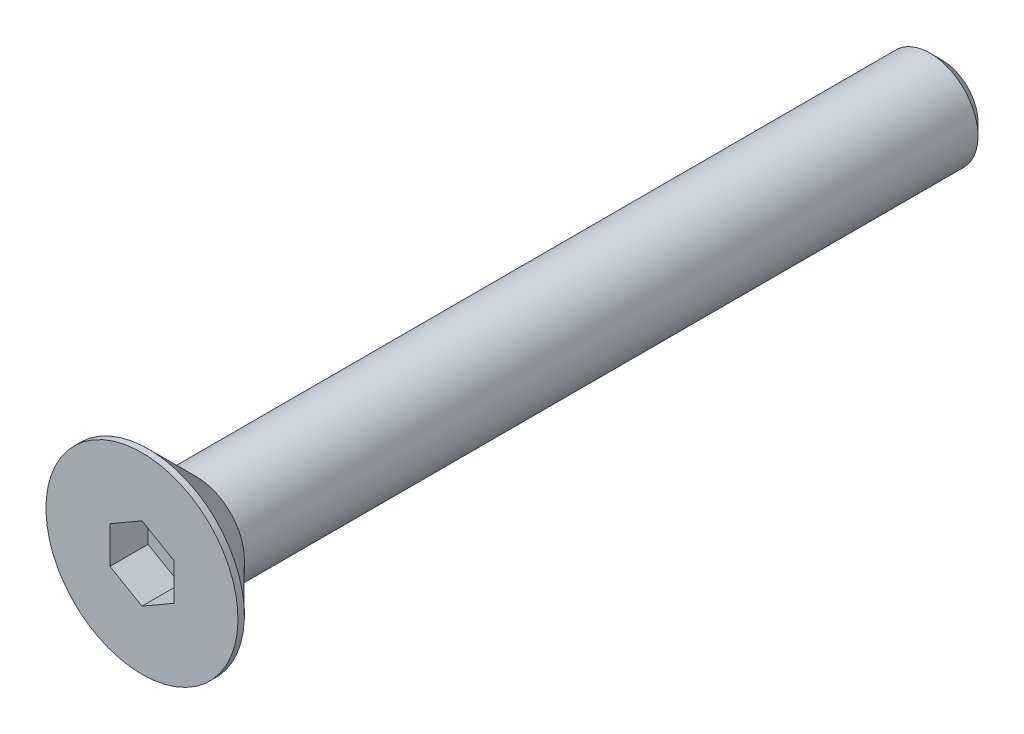
ISO-10303-21;
HEADER;
FILE_DESCRIPTION(('STEP AP214'),'2;1');
FILE_NAME('part.step','',(''),(''),'','','');
FILE_SCHEMA(('AUTOMOTIVE_DESIGN { 1 0 10303 214 1 1 1 1 }'));
ENDSEC;
DATA;
#1=APPLICATION_CONTEXT('core data for automotive mechanical design processes');
#2=APPLICATION_PROTOCOL_DEFINITION('international standard','automotive_design',2000,#1);
#3=PRODUCT_CONTEXT('',#1,'mechanical');
#4=PRODUCT('Part','Part','',(#3));
#5=PRODUCT_RELATED_PRODUCT_CATEGORY('part','',(#4));
#6=PRODUCT_DEFINITION_FORMATION('','',#4);
#7=PRODUCT_DEFINITION_CONTEXT('part definition',#1,'design');
#8=PRODUCT_DEFINITION('design','',#6,#7);
#9=PRODUCT_DEFINITION_SHAPE('','',#8);
#10=(LENGTH_UNIT() NAMED_UNIT(*) SI_UNIT(.MILLI.,.METRE.));
#11=(NAMED_UNIT(*) PLANE_ANGLE_UNIT() SI_UNIT($,.RADIAN.));
#12=(NAMED_UNIT(*) SI_UNIT($,.STERADIAN.) SOLID_ANGLE_UNIT());
#13=UNCERTAINTY_MEASURE_WITH_UNIT(LENGTH_MEASURE(1.E-05),#10,'distance_accuracy_value','');
#14=(GEOMETRIC_REPRESENTATION_CONTEXT(3) GLOBAL_UNCERTAINTY_ASSIGNED_CONTEXT((#13)) GLOBAL_UNIT_ASSIGNED_CONTEXT((#10,
#11,#12)) REPRESENTATION_CONTEXT('',''));
#15=CARTESIAN_POINT('',(0.,0.,0.));
#16=DIRECTION('',(0.,0.,1.));
#17=DIRECTION('',(1.,0.,0.));
#18=AXIS2_PLACEMENT_3D('',#15,#16,#17);
#19=CARTESIAN_POINT('',(0.,0.,-25.));
#20=DIRECTION('',(0.,0.,-1.));
#21=DIRECTION('',(0.,1.,0.));
#22=AXIS2_PLACEMENT_3D('',#19,#20,#21);
#23=CYLINDRICAL_SURFACE('',#22,1.5);
#24=CARTESIAN_POINT('',(0.,0.,-24.625));
#25=DIRECTION('',(0.,0.,-1.));
#26=DIRECTION('',(0.,1.,0.));
#27=AXIS2_PLACEMENT_3D('',#24,#25,#26);
#28=CIRCLE('',#27,1.5);
#29=CARTESIAN_POINT('',(0.,1.5,-24.625));
#30=VERTEX_POINT('',#29);
#31=EDGE_CURVE('E11',#30,#30,#28,.F.);
#32=ORIENTED_EDGE('',*,*,#31,.T.);
#33=EDGE_LOOP('',(#32));
#34=FACE_BOUND('',#33,.T.);
#35=CARTESIAN_POINT('',(0.,0.,-1.7));
#36=DIRECTION('',(0.,0.,1.));
#37=DIRECTION('',(0.,-1.,0.));
#38=AXIS2_PLACEMENT_3D('',#35,#36,#37);
#39=CIRCLE('',#38,1.50000000000001);
#40=CARTESIAN_POINT('',(0.,-1.50000000000001,-1.7));
#41=VERTEX_POINT('',#40);
#42=EDGE_CURVE('E140',#41,#41,#39,.T.);
#43=ORIENTED_EDGE('',*,*,#42,.F.);
#44=EDGE_LOOP('',(#43));
#45=FACE_BOUND('',#44,.T.);
#46=ADVANCED_FACE('F38',(#34,#45),#23,.T.);
#47=CARTESIAN_POINT('',(0.,-1.5,-25.));
#48=DIRECTION('',(0.,0.,-1.));
#49=DIRECTION('',(0.,1.,0.));
#50=AXIS2_PLACEMENT_3D('',#47,#48,#49);
#51=PLANE('',#50);
#52=CARTESIAN_POINT('',(0.,0.,-25.));
#53=DIRECTION('',(0.,0.,-1.));
#54=DIRECTION('',(0.,1.,0.));
#55=AXIS2_PLACEMENT_3D('',#52,#53,#54);
#56=CIRCLE('',#55,1.125);
#57=CARTESIAN_POINT('',(0.,1.125,-25.));
#58=VERTEX_POINT('',#57);
#59=EDGE_CURVE('E46',#58,#58,#56,.T.);
#60=ORIENTED_EDGE('',*,*,#59,.T.);
#61=EDGE_LOOP('',(#60));
#62=FACE_BOUND('',#61,.T.);
#63=ADVANCED_FACE('F156',(#62),#51,.T.);
#64=CARTESIAN_POINT('',(0.,0.,-25.));
#65=DIRECTION('',(0.,0.,1.));
#66=DIRECTION('',(0.,-1.,0.));
#67=AXIS2_PLACEMENT_3D('',#64,#65,#66);
#68=CONICAL_SURFACE('',#67,1.125,0.785398163397445);
#69=ORIENTED_EDGE('',*,*,#31,.F.);
#70=EDGE_LOOP('',(#69));
#71=FACE_BOUND('',#70,.T.);
#72=ORIENTED_EDGE('',*,*,#59,.F.);
#73=EDGE_LOOP('',(#72));
#74=FACE_BOUND('',#73,.T.);
#75=ADVANCED_FACE('F40',(#71,#74),#68,.T.);
#76=CARTESIAN_POINT('',(0.,0.,0.));
#77=DIRECTION('',(0.,0.,1.));
#78=DIRECTION('',(0.,-1.,0.));
#79=AXIS2_PLACEMENT_3D('',#76,#77,#78);
#80=CYLINDRICAL_SURFACE('',#79,3.);
#81=CARTESIAN_POINT('',(0.,0.,0.));
#82=DIRECTION('',(0.,0.,1.));
#83=DIRECTION('',(0.,-1.,0.));
#84=AXIS2_PLACEMENT_3D('',#81,#82,#83);
#85=CIRCLE('',#84,3.);
#86=CARTESIAN_POINT('',(0.,-3.,0.));
#87=VERTEX_POINT('',#86);
#88=EDGE_CURVE('E151',#87,#87,#85,.T.);
#89=ORIENTED_EDGE('',*,*,#88,.F.);
#90=EDGE_LOOP('',(#89));
#91=FACE_BOUND('',#90,.T.);
#92=CARTESIAN_POINT('',(0.,0.,-0.200000000000009));
#93=DIRECTION('',(0.,0.,1.));
#94=DIRECTION('',(0.,-1.,0.));
#95=AXIS2_PLACEMENT_3D('',#92,#93,#94);
#96=CIRCLE('',#95,3.);
#97=CARTESIAN_POINT('',(0.,-3.,-0.200000000000006));
#98=VERTEX_POINT('',#97);
#99=EDGE_CURVE('E148',#98,#98,#96,.T.);
#100=ORIENTED_EDGE('',*,*,#99,.T.);
#101=EDGE_LOOP('',(#100));
#102=FACE_BOUND('',#101,.T.);
#103=ADVANCED_FACE('F159',(#91,#102),#80,.T.);
#104=CARTESIAN_POINT('',(0.,0.,-1.7));
#105=DIRECTION('',(0.,0.,1.));
#106=DIRECTION('',(0.,-1.,0.));
#107=AXIS2_PLACEMENT_3D('',#104,#105,#106);
#108=CONICAL_SURFACE('',#107,1.50000000000001,0.785398163397449);
#109=ORIENTED_EDGE('',*,*,#99,.F.);
#110=EDGE_LOOP('',(#109));
#111=FACE_BOUND('',#110,.T.);
#112=ORIENTED_EDGE('',*,*,#42,.T.);
#113=EDGE_LOOP('',(#112));
#114=FACE_BOUND('',#113,.T.);
#115=ADVANCED_FACE('F165',(#111,#114),#108,.T.);
#116=CARTESIAN_POINT('',(0.,-1.5,0.));
#117=DIRECTION('',(0.,0.,1.));
#118=DIRECTION('',(0.,-1.,0.));
#119=AXIS2_PLACEMENT_3D('',#116,#117,#118);
#120=PLANE('',#119);
#121=DIRECTION('',(0.866025403784439,0.499999999999999,0.));
#122=VECTOR('',#121,1.);
#123=CARTESIAN_POINT('',(0.,-1.15470053837925,0.));
#124=LINE('',#123,#122);
#125=CARTESIAN_POINT('',(0.,-1.15470053837925,0.));
#126=VERTEX_POINT('',#125);
#127=CARTESIAN_POINT('',(1.,-0.577350269189626,0.));
#128=VERTEX_POINT('',#127);
#129=EDGE_CURVE('E53',#126,#128,#124,.T.);
#130=ORIENTED_EDGE('',*,*,#129,.F.);
#131=DIRECTION('',(0.866025403784439,-0.5,0.));
#132=VECTOR('',#131,1.);
#133=CARTESIAN_POINT('',(-1.,-0.577350269189626,0.));
#134=LINE('',#133,#132);
#135=CARTESIAN_POINT('',(-1.,-0.577350269189626,0.));
#136=VERTEX_POINT('',#135);
#137=EDGE_CURVE('E136',#136,#126,#134,.T.);
#138=ORIENTED_EDGE('',*,*,#137,.F.);
#139=DIRECTION('',(0.,-1.,0.));
#140=VECTOR('',#139,1.);
#141=CARTESIAN_POINT('',(-1.,0.577350269189626,0.));
#142=LINE('',#141,#140);
#143=CARTESIAN_POINT('',(-1.,0.577350269189626,0.));
#144=VERTEX_POINT('',#143);
#145=EDGE_CURVE('E134',#144,#136,#142,.T.);
#146=ORIENTED_EDGE('',*,*,#145,.F.);
#147=DIRECTION('',(-0.866025403784439,-0.5,0.));
#148=VECTOR('',#147,1.);
#149=CARTESIAN_POINT('',(0.,1.15470053837925,0.));
#150=LINE('',#149,#148);
#151=CARTESIAN_POINT('',(0.,1.15470053837925,0.));
#152=VERTEX_POINT('',#151);
#153=EDGE_CURVE('E101',#152,#144,#150,.T.);
#154=ORIENTED_EDGE('',*,*,#153,.F.);
#155=DIRECTION('',(-0.866025403784439,0.5,0.));
#156=VECTOR('',#155,1.);
#157=CARTESIAN_POINT('',(1.,0.577350269189626,0.));
#158=LINE('',#157,#156);
#159=CARTESIAN_POINT('',(1.,0.577350269189626,0.));
#160=VERTEX_POINT('',#159);
#161=EDGE_CURVE('E130',#160,#152,#158,.T.);
#162=ORIENTED_EDGE('',*,*,#161,.F.);
#163=DIRECTION('',(0.,1.,0.));
#164=VECTOR('',#163,1.);
#165=CARTESIAN_POINT('',(1.,-0.577350269189626,0.));
#166=LINE('',#165,#164);
#167=EDGE_CURVE('E127',#128,#160,#166,.T.);
#168=ORIENTED_EDGE('',*,*,#167,.F.);
#169=EDGE_LOOP('',(#130,#138,#146,#154,#162,#168));
#170=FACE_BOUND('',#169,.T.);
#171=ORIENTED_EDGE('',*,*,#88,.T.);
#172=EDGE_LOOP('',(#171));
#173=FACE_BOUND('',#172,.T.);
#174=ADVANCED_FACE('F177',(#170,#173),#120,.T.);
#175=CARTESIAN_POINT('',(0.,-1.15470053837925,-1.19));
#176=DIRECTION('',(0.499999999999999,-0.866025403784439,0.));
#177=DIRECTION('',(0.866025403784439,0.5,0.));
#178=AXIS2_PLACEMENT_3D('',#175,#176,#177);
#179=PLANE('',#178);
#180=ORIENTED_EDGE('',*,*,#129,.T.);
#181=DIRECTION('',(0.,0.,1.));
#182=VECTOR('',#181,1.);
#183=CARTESIAN_POINT('',(1.,-0.577350269189626,-1.19));
#184=LINE('',#183,#182);
#185=CARTESIAN_POINT('',(1.,-0.577350269189626,-1.19));
#186=VERTEX_POINT('',#185);
#187=EDGE_CURVE('E83',#186,#128,#184,.T.);
#188=ORIENTED_EDGE('',*,*,#187,.F.);
#189=DIRECTION('',(0.866025403784439,0.499999999999999,0.));
#190=VECTOR('',#189,1.);
#191=CARTESIAN_POINT('',(0.,-1.15470053837925,-1.19));
#192=LINE('',#191,#190);
#193=CARTESIAN_POINT('',(0.,-1.15470053837925,-1.19));
#194=VERTEX_POINT('',#193);
#195=EDGE_CURVE('E138',#194,#186,#192,.T.);
#196=ORIENTED_EDGE('',*,*,#195,.F.);
#197=DIRECTION('',(0.,0.,1.));
#198=VECTOR('',#197,1.);
#199=CARTESIAN_POINT('',(0.,-1.15470053837925,-1.19));
#200=LINE('',#199,#198);
#201=EDGE_CURVE('E61',#194,#126,#200,.T.);
#202=ORIENTED_EDGE('',*,*,#201,.T.);
#203=EDGE_LOOP('',(#180,#188,#196,#202));
#204=FACE_BOUND('',#203,.T.);
#205=ADVANCED_FACE('F179',(#204),#179,.F.);
#206=CARTESIAN_POINT('',(-1.,-0.577350269189626,-1.19));
#207=DIRECTION('',(-0.5,-0.866025403784439,0.));
#208=DIRECTION('',(0.866025403784439,-0.5,0.));
#209=AXIS2_PLACEMENT_3D('',#206,#207,#208);
#210=PLANE('',#209);
#211=ORIENTED_EDGE('',*,*,#137,.T.);
#212=ORIENTED_EDGE('',*,*,#201,.F.);
#213=DIRECTION('',(0.866025403784439,-0.5,0.));
#214=VECTOR('',#213,1.);
#215=CARTESIAN_POINT('',(-1.,-0.577350269189626,-1.19));
#216=LINE('',#215,#214);
#217=CARTESIAN_POINT('',(-1.,-0.577350269189626,-1.19));
#218=VERTEX_POINT('',#217);
#219=EDGE_CURVE('E113',#218,#194,#216,.T.);
#220=ORIENTED_EDGE('',*,*,#219,.F.);
#221=DIRECTION('',(0.,0.,1.));
#222=VECTOR('',#221,1.);
#223=CARTESIAN_POINT('',(-1.,-0.577350269189626,-1.19));
#224=LINE('',#223,#222);
#225=EDGE_CURVE('E105',#218,#136,#224,.T.);
#226=ORIENTED_EDGE('',*,*,#225,.T.);
#227=EDGE_LOOP('',(#211,#212,#220,#226));
#228=FACE_BOUND('',#227,.T.);
#229=ADVANCED_FACE('F185',(#228),#210,.F.);
#230=CARTESIAN_POINT('',(-1.,0.577350269189626,-1.19));
#231=DIRECTION('',(-1.,0.,0.));
#232=DIRECTION('',(0.,0.,1.));
#233=AXIS2_PLACEMENT_3D('',#230,#231,#232);
#234=PLANE('',#233);
#235=ORIENTED_EDGE('',*,*,#145,.T.);
#236=ORIENTED_EDGE('',*,*,#225,.F.);
#237=DIRECTION('',(0.,-1.,0.));
#238=VECTOR('',#237,1.);
#239=CARTESIAN_POINT('',(-1.,0.577350269189626,-1.19));
#240=LINE('',#239,#238);
#241=CARTESIAN_POINT('',(-1.,0.577350269189626,-1.19));
#242=VERTEX_POINT('',#241);
#243=EDGE_CURVE('E109',#242,#218,#240,.T.);
#244=ORIENTED_EDGE('',*,*,#243,.F.);
#245=DIRECTION('',(0.,0.,1.));
#246=VECTOR('',#245,1.);
#247=CARTESIAN_POINT('',(-1.,0.577350269189626,-1.19));
#248=LINE('',#247,#246);
#249=EDGE_CURVE('E94',#242,#144,#248,.T.);
#250=ORIENTED_EDGE('',*,*,#249,.T.);
#251=EDGE_LOOP('',(#235,#236,#244,#250));
#252=FACE_BOUND('',#251,.T.);
#253=ADVANCED_FACE('F110',(#252),#234,.F.);
#254=CARTESIAN_POINT('',(0.,1.15470053837925,-1.19));
#255=DIRECTION('',(-0.5,0.866025403784439,0.));
#256=DIRECTION('',(-0.866025403784439,-0.5,0.));
#257=AXIS2_PLACEMENT_3D('',#254,#255,#256);
#258=PLANE('',#257);
#259=ORIENTED_EDGE('',*,*,#153,.T.);
#260=ORIENTED_EDGE('',*,*,#249,.F.);
#261=DIRECTION('',(-0.866025403784439,-0.5,0.));
#262=VECTOR('',#261,1.);
#263=CARTESIAN_POINT('',(0.,1.15470053837925,-1.19));
#264=LINE('',#263,#262);
#265=CARTESIAN_POINT('',(0.,1.15470053837925,-1.19));
#266=VERTEX_POINT('',#265);
#267=EDGE_CURVE('E98',#266,#242,#264,.T.);
#268=ORIENTED_EDGE('',*,*,#267,.F.);
#269=DIRECTION('',(0.,0.,1.));
#270=VECTOR('',#269,1.);
#271=CARTESIAN_POINT('',(0.,1.15470053837925,-1.19));
#272=LINE('',#271,#270);
#273=EDGE_CURVE('E106',#266,#152,#272,.T.);
#274=ORIENTED_EDGE('',*,*,#273,.T.);
#275=EDGE_LOOP('',(#259,#260,#268,#274));
#276=FACE_BOUND('',#275,.T.);
#277=ADVANCED_FACE('F96',(#276),#258,.F.);
#278=CARTESIAN_POINT('',(1.,0.577350269189626,-1.19));
#279=DIRECTION('',(0.5,0.866025403784439,0.));
#280=DIRECTION('',(-0.866025403784439,0.5,0.));
#281=AXIS2_PLACEMENT_3D('',#278,#279,#280);
#282=PLANE('',#281);
#283=ORIENTED_EDGE('',*,*,#161,.T.);
#284=ORIENTED_EDGE('',*,*,#273,.F.);
#285=DIRECTION('',(-0.866025403784439,0.5,0.));
#286=VECTOR('',#285,1.);
#287=CARTESIAN_POINT('',(1.,0.577350269189626,-1.19));
#288=LINE('',#287,#286);
#289=CARTESIAN_POINT('',(1.,0.577350269189626,-1.19));
#290=VERTEX_POINT('',#289);
#291=EDGE_CURVE('E119',#290,#266,#288,.T.);
#292=ORIENTED_EDGE('',*,*,#291,.F.);
#293=DIRECTION('',(0.,0.,1.));
#294=VECTOR('',#293,1.);
#295=CARTESIAN_POINT('',(1.,0.577350269189626,-1.19));
#296=LINE('',#295,#294);
#297=EDGE_CURVE('E143',#290,#160,#296,.T.);
#298=ORIENTED_EDGE('',*,*,#297,.T.);
#299=EDGE_LOOP('',(#283,#284,#292,#298));
#300=FACE_BOUND('',#299,.T.);
#301=ADVANCED_FACE('F210',(#300),#282,.F.);
#302=CARTESIAN_POINT('',(1.,-0.577350269189626,-1.19));
#303=DIRECTION('',(1.,0.,0.));
#304=DIRECTION('',(0.,1.,0.));
#305=AXIS2_PLACEMENT_3D('',#302,#303,#304);
#306=PLANE('',#305);
#307=ORIENTED_EDGE('',*,*,#167,.T.);
#308=ORIENTED_EDGE('',*,*,#297,.F.);
#309=DIRECTION('',(0.,1.,0.));
#310=VECTOR('',#309,1.);
#311=CARTESIAN_POINT('',(1.,-0.577350269189626,-1.19));
#312=LINE('',#311,#310);
#313=EDGE_CURVE('E121',#186,#290,#312,.T.);
#314=ORIENTED_EDGE('',*,*,#313,.F.);
#315=ORIENTED_EDGE('',*,*,#187,.T.);
#316=EDGE_LOOP('',(#307,#308,#314,#315));
#317=FACE_BOUND('',#316,.T.);
#318=ADVANCED_FACE('F198',(#317),#306,.F.);
#319=CARTESIAN_POINT('',(1.,-0.577350269189626,-1.19));
#320=DIRECTION('',(0.,0.,1.));
#321=DIRECTION('',(1.,0.,0.));
#322=AXIS2_PLACEMENT_3D('',#319,#320,#321);
#323=PLANE('',#322);
#324=ORIENTED_EDGE('',*,*,#195,.T.);
#325=ORIENTED_EDGE('',*,*,#313,.T.);
#326=ORIENTED_EDGE('',*,*,#291,.T.);
#327=ORIENTED_EDGE('',*,*,#267,.T.);
#328=ORIENTED_EDGE('',*,*,#243,.T.);
#329=ORIENTED_EDGE('',*,*,#219,.T.);
#330=EDGE_LOOP('',(#324,#325,#326,#327,#328,#329));
#331=FACE_BOUND('',#330,.T.);
#332=ADVANCED_FACE('F116',(#331),#323,.T.);
#333=CLOSED_SHELL('',(#46,#63,#75,#103,#115,#174,#205,#229,#253,#277,#301,#318,#332));
#334=MANIFOLD_SOLID_BREP('B2',#333);
#335=ADVANCED_BREP_SHAPE_REPRESENTATION('',(#18,#334),#14);
#336=SHAPE_DEFINITION_REPRESENTATION(#9,#335);
ENDSEC;
END-ISO-10303-21;
